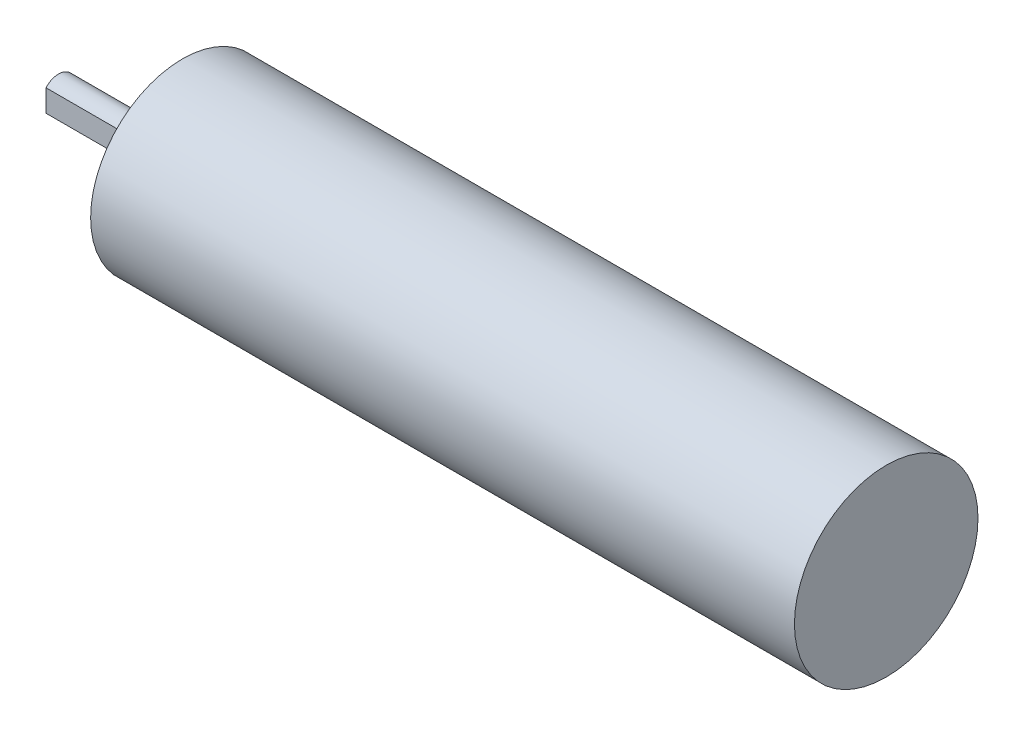
ISO-10303-21;
HEADER;
FILE_DESCRIPTION(('STEP AP214'),'2;1');
FILE_NAME('part.step','',(''),(''),'','','');
FILE_SCHEMA(('AUTOMOTIVE_DESIGN { 1 0 10303 214 1 1 1 1 }'));
ENDSEC;
DATA;
#1=APPLICATION_CONTEXT('core data for automotive mechanical design processes');
#2=APPLICATION_PROTOCOL_DEFINITION('international standard','automotive_design',2000,#1);
#3=PRODUCT_CONTEXT('',#1,'mechanical');
#4=PRODUCT('Part','Part','',(#3));
#5=PRODUCT_RELATED_PRODUCT_CATEGORY('part','',(#4));
#6=PRODUCT_DEFINITION_FORMATION('','',#4);
#7=PRODUCT_DEFINITION_CONTEXT('part definition',#1,'design');
#8=PRODUCT_DEFINITION('design','',#6,#7);
#9=PRODUCT_DEFINITION_SHAPE('','',#8);
#10=(LENGTH_UNIT() NAMED_UNIT(*) SI_UNIT(.MILLI.,.METRE.));
#11=(NAMED_UNIT(*) PLANE_ANGLE_UNIT() SI_UNIT($,.RADIAN.));
#12=(NAMED_UNIT(*) SI_UNIT($,.STERADIAN.) SOLID_ANGLE_UNIT());
#13=UNCERTAINTY_MEASURE_WITH_UNIT(LENGTH_MEASURE(1.E-05),#10,'distance_accuracy_value','');
#14=(GEOMETRIC_REPRESENTATION_CONTEXT(3) GLOBAL_UNCERTAINTY_ASSIGNED_CONTEXT((#13)) GLOBAL_UNIT_ASSIGNED_CONTEXT((#10,
#11,#12)) REPRESENTATION_CONTEXT('',''));
#15=CARTESIAN_POINT('',(0.,0.,0.));
#16=DIRECTION('',(0.,0.,1.));
#17=DIRECTION('',(1.,0.,0.));
#18=AXIS2_PLACEMENT_3D('',#15,#16,#17);
#19=CARTESIAN_POINT('',(-3.15,0.,0.));
#20=DIRECTION('',(-1.,0.,0.));
#21=DIRECTION('',(0.,0.,1.));
#22=AXIS2_PLACEMENT_3D('',#19,#20,#21);
#23=PLANE('',#22);
#24=CARTESIAN_POINT('',(-3.15,0.,0.));
#25=DIRECTION('',(-1.,0.,0.));
#26=DIRECTION('',(0.,0.,1.));
#27=AXIS2_PLACEMENT_3D('',#24,#25,#26);
#28=CIRCLE('',#27,3.5);
#29=CARTESIAN_POINT('',(-3.15,0.,3.5));
#30=VERTEX_POINT('',#29);
#31=EDGE_CURVE('E87',#30,#30,#28,.T.);
#32=ORIENTED_EDGE('',*,*,#31,.T.);
#33=EDGE_LOOP('',(#32));
#34=FACE_BOUND('',#33,.T.);
#35=CARTESIAN_POINT('',(-3.15,0.,0.));
#36=DIRECTION('',(-1.,0.,0.));
#37=DIRECTION('',(0.,0.,1.));
#38=AXIS2_PLACEMENT_3D('',#35,#36,#37);
#39=CIRCLE('',#38,2.);
#40=CARTESIAN_POINT('',(-3.15,0.,2.));
#41=VERTEX_POINT('',#40);
#42=EDGE_CURVE('E78',#41,#41,#39,.T.);
#43=ORIENTED_EDGE('',*,*,#42,.F.);
#44=EDGE_LOOP('',(#43));
#45=FACE_BOUND('',#44,.T.);
#46=ADVANCED_FACE('F36',(#34,#45),#23,.T.);
#47=CARTESIAN_POINT('',(-1.35,0.,0.));
#48=DIRECTION('',(-1.,0.,0.));
#49=DIRECTION('',(0.,0.,1.));
#50=AXIS2_PLACEMENT_3D('',#47,#48,#49);
#51=PLANE('',#50);
#52=CARTESIAN_POINT('',(-1.35,0.,0.));
#53=DIRECTION('',(-1.,0.,0.));
#54=DIRECTION('',(0.,0.,1.));
#55=AXIS2_PLACEMENT_3D('',#52,#53,#54);
#56=CIRCLE('',#55,5.);
#57=CARTESIAN_POINT('',(-1.35,0.,-5.));
#58=VERTEX_POINT('',#57);
#59=EDGE_CURVE('E45',#58,#58,#56,.T.);
#60=ORIENTED_EDGE('',*,*,#59,.T.);
#61=EDGE_LOOP('',(#60));
#62=FACE_BOUND('',#61,.T.);
#63=CARTESIAN_POINT('',(-1.35,0.,0.));
#64=DIRECTION('',(-1.,0.,0.));
#65=DIRECTION('',(0.,0.,1.));
#66=AXIS2_PLACEMENT_3D('',#63,#64,#65);
#67=CIRCLE('',#66,3.5);
#68=CARTESIAN_POINT('',(-1.35,0.,3.5));
#69=VERTEX_POINT('',#68);
#70=EDGE_CURVE('E84',#69,#69,#67,.T.);
#71=ORIENTED_EDGE('',*,*,#70,.F.);
#72=EDGE_LOOP('',(#71));
#73=FACE_BOUND('',#72,.T.);
#74=ADVANCED_FACE('F101',(#62,#73),#51,.T.);
#75=CARTESIAN_POINT('',(0.,11.,0.));
#76=DIRECTION('',(-1.,0.,0.));
#77=DIRECTION('',(0.,0.,1.));
#78=AXIS2_PLACEMENT_3D('',#75,#76,#77);
#79=PLANE('',#78);
#80=CARTESIAN_POINT('',(0.,6.06217782649,-3.5));
#81=DIRECTION('',(-1.,0.,0.));
#82=DIRECTION('',(0.,0.,1.));
#83=AXIS2_PLACEMENT_3D('',#80,#81,#82);
#84=CIRCLE('',#83,0.975000000000014);
#85=CARTESIAN_POINT('',(0.,6.06217782649,-2.52499999999999));
#86=VERTEX_POINT('',#85);
#87=EDGE_CURVE('E425',#86,#86,#84,.T.);
#88=ORIENTED_EDGE('',*,*,#87,.F.);
#89=EDGE_LOOP('',(#88));
#90=FACE_BOUND('',#89,.T.);
#91=CARTESIAN_POINT('',(0.,-6.06217782649,-3.5));
#92=DIRECTION('',(-1.,0.,0.));
#93=DIRECTION('',(0.,0.,1.));
#94=AXIS2_PLACEMENT_3D('',#91,#92,#93);
#95=CIRCLE('',#94,0.975000000000014);
#96=CARTESIAN_POINT('',(0.,-6.06217782649,-2.52499999999999));
#97=VERTEX_POINT('',#96);
#98=EDGE_CURVE('E431',#97,#97,#95,.T.);
#99=ORIENTED_EDGE('',*,*,#98,.F.);
#100=EDGE_LOOP('',(#99));
#101=FACE_BOUND('',#100,.T.);
#102=CARTESIAN_POINT('',(0.,0.,7.));
#103=DIRECTION('',(-1.,0.,0.));
#104=DIRECTION('',(0.,0.,1.));
#105=AXIS2_PLACEMENT_3D('',#102,#103,#104);
#106=CIRCLE('',#105,0.975000000000014);
#107=CARTESIAN_POINT('',(0.,0.,7.97500000000001));
#108=VERTEX_POINT('',#107);
#109=EDGE_CURVE('E437',#108,#108,#106,.T.);
#110=ORIENTED_EDGE('',*,*,#109,.F.);
#111=EDGE_LOOP('',(#110));
#112=FACE_BOUND('',#111,.T.);
#113=CARTESIAN_POINT('',(0.,0.,0.));
#114=DIRECTION('',(1.,0.,0.));
#115=DIRECTION('',(0.,0.,-1.));
#116=AXIS2_PLACEMENT_3D('',#113,#114,#115);
#117=CIRCLE('',#116,11.);
#118=CARTESIAN_POINT('',(0.,0.,-11.));
#119=VERTEX_POINT('',#118);
#120=EDGE_CURVE('E11',#119,#119,#117,.T.);
#121=ORIENTED_EDGE('',*,*,#120,.F.);
#122=EDGE_LOOP('',(#121));
#123=FACE_BOUND('',#122,.T.);
#124=CARTESIAN_POINT('',(0.,0.,0.));
#125=DIRECTION('',(-1.,0.,0.));
#126=DIRECTION('',(0.,0.,1.));
#127=AXIS2_PLACEMENT_3D('',#124,#125,#126);
#128=CIRCLE('',#127,5.);
#129=CARTESIAN_POINT('',(0.,0.,-5.));
#130=VERTEX_POINT('',#129);
#131=EDGE_CURVE('E90',#130,#130,#128,.T.);
#132=ORIENTED_EDGE('',*,*,#131,.F.);
#133=EDGE_LOOP('',(#132));
#134=FACE_BOUND('',#133,.T.);
#135=ADVANCED_FACE('F99',(#90,#101,#112,#123,#134),#79,.T.);
#136=CARTESIAN_POINT('',(0.,0.,0.));
#137=DIRECTION('',(1.,0.,0.));
#138=DIRECTION('',(0.,0.,-1.));
#139=AXIS2_PLACEMENT_3D('',#136,#137,#138);
#140=CYLINDRICAL_SURFACE('',#139,11.);
#141=ORIENTED_EDGE('',*,*,#120,.T.);
#142=EDGE_LOOP('',(#141));
#143=FACE_BOUND('',#142,.T.);
#144=CARTESIAN_POINT('',(84.35,0.,0.));
#145=DIRECTION('',(1.,0.,0.));
#146=DIRECTION('',(0.,0.,-1.));
#147=AXIS2_PLACEMENT_3D('',#144,#145,#146);
#148=CIRCLE('',#147,11.);
#149=CARTESIAN_POINT('',(84.35,0.,-11.));
#150=VERTEX_POINT('',#149);
#151=EDGE_CURVE('E400',#150,#150,#148,.T.);
#152=ORIENTED_EDGE('',*,*,#151,.F.);
#153=EDGE_LOOP('',(#152));
#154=FACE_BOUND('',#153,.T.);
#155=ADVANCED_FACE('F38',(#143,#154),#140,.T.);
#156=CARTESIAN_POINT('',(-1.35,0.,0.));
#157=DIRECTION('',(1.,0.,0.));
#158=DIRECTION('',(0.,0.,-1.));
#159=AXIS2_PLACEMENT_3D('',#156,#157,#158);
#160=CYLINDRICAL_SURFACE('',#159,5.);
#161=CARTESIAN_POINT('',(-1.35,0.,-5.));
#162=CARTESIAN_POINT('',(-1.3359375,0.,-5.));
#163=CARTESIAN_POINT('',(-1.321875,0.,-5.));
#164=CARTESIAN_POINT('',(-1.29375,0.,-5.));
#165=CARTESIAN_POINT('',(-1.2796875,0.,-5.));
#166=CARTESIAN_POINT('',(-1.2515625,0.,-5.));
#167=CARTESIAN_POINT('',(-1.2375,0.,-5.));
#168=CARTESIAN_POINT('',(-1.209375,0.,-5.));
#169=CARTESIAN_POINT('',(-1.1953125,0.,-5.));
#170=CARTESIAN_POINT('',(-1.1671875,0.,-5.));
#171=CARTESIAN_POINT('',(-1.153125,0.,-5.));
#172=CARTESIAN_POINT('',(-1.125,0.,-5.));
#173=CARTESIAN_POINT('',(-1.1109375,0.,-5.));
#174=CARTESIAN_POINT('',(-1.0828125,0.,-5.));
#175=CARTESIAN_POINT('',(-1.06875,0.,-5.));
#176=CARTESIAN_POINT('',(-1.040625,0.,-5.));
#177=CARTESIAN_POINT('',(-1.0265625,0.,-5.));
#178=CARTESIAN_POINT('',(-0.9984375,0.,-5.));
#179=CARTESIAN_POINT('',(-0.984375,0.,-5.));
#180=CARTESIAN_POINT('',(-0.95625,0.,-5.));
#181=CARTESIAN_POINT('',(-0.9421875,0.,-5.));
#182=CARTESIAN_POINT('',(-0.9140625,0.,-5.));
#183=CARTESIAN_POINT('',(-0.9,0.,-5.));
#184=CARTESIAN_POINT('',(-0.871875,0.,-5.));
#185=CARTESIAN_POINT('',(-0.8578125,0.,-5.));
#186=CARTESIAN_POINT('',(-0.8296875,0.,-5.));
#187=CARTESIAN_POINT('',(-0.815625,0.,-5.));
#188=CARTESIAN_POINT('',(-0.7875,0.,-5.));
#189=CARTESIAN_POINT('',(-0.7734375,0.,-5.));
#190=CARTESIAN_POINT('',(-0.7453125,0.,-5.));
#191=CARTESIAN_POINT('',(-0.73125,0.,-5.));
#192=CARTESIAN_POINT('',(-0.703125,0.,-5.));
#193=CARTESIAN_POINT('',(-0.6890625,0.,-5.));
#194=CARTESIAN_POINT('',(-0.6609375,0.,-5.));
#195=CARTESIAN_POINT('',(-0.646875,0.,-5.));
#196=CARTESIAN_POINT('',(-0.61875,0.,-5.));
#197=CARTESIAN_POINT('',(-0.6046875,0.,-5.));
#198=CARTESIAN_POINT('',(-0.5765625,0.,-5.));
#199=CARTESIAN_POINT('',(-0.5625,0.,-5.));
#200=CARTESIAN_POINT('',(-0.534375,0.,-5.));
#201=CARTESIAN_POINT('',(-0.5203125,0.,-5.));
#202=CARTESIAN_POINT('',(-0.4921875,0.,-5.));
#203=CARTESIAN_POINT('',(-0.478125,0.,-5.));
#204=CARTESIAN_POINT('',(-0.45,0.,-5.));
#205=CARTESIAN_POINT('',(-0.4359375,0.,-5.));
#206=CARTESIAN_POINT('',(-0.4078125,0.,-5.));
#207=CARTESIAN_POINT('',(-0.39375,0.,-5.));
#208=CARTESIAN_POINT('',(-0.365625,0.,-5.));
#209=CARTESIAN_POINT('',(-0.3515625,0.,-5.));
#210=CARTESIAN_POINT('',(-0.3234375,0.,-5.));
#211=CARTESIAN_POINT('',(-0.309375,0.,-5.));
#212=CARTESIAN_POINT('',(-0.28125,0.,-5.));
#213=CARTESIAN_POINT('',(-0.2671875,0.,-5.));
#214=CARTESIAN_POINT('',(-0.2390625,0.,-5.));
#215=CARTESIAN_POINT('',(-0.225,0.,-5.));
#216=CARTESIAN_POINT('',(-0.196875,0.,-5.));
#217=CARTESIAN_POINT('',(-0.1828125,0.,-5.));
#218=CARTESIAN_POINT('',(-0.1546875,0.,-5.));
#219=CARTESIAN_POINT('',(-0.140625,0.,-5.));
#220=CARTESIAN_POINT('',(-0.1125,0.,-5.));
#221=CARTESIAN_POINT('',(-0.0984374999999998,0.,-5.));
#222=CARTESIAN_POINT('',(-0.0703124999999998,0.,-5.));
#223=CARTESIAN_POINT('',(-0.0562499999999997,0.,-5.));
#224=CARTESIAN_POINT('',(-0.0281249999999997,0.,-5.));
#225=CARTESIAN_POINT('',(-0.0140624999999997,0.,-5.));
#226=CARTESIAN_POINT('',(0.,0.,-5.));
#227=B_SPLINE_CURVE_WITH_KNOTS('',3,(#161,#162,#163,#164,#165,#166,#167,#168,#169,#170,#171,
#172,#173,#174,#175,#176,#177,#178,#179,#180,#181,#182,#183,#184,#185,#186,#187,#188,#189,#190,
#191,#192,#193,#194,#195,#196,#197,#198,#199,#200,#201,#202,#203,#204,#205,#206,#207,#208,#209,
#210,#211,#212,#213,#214,#215,#216,#217,#218,#219,#220,#221,#222,#223,#224,#225,#226),
.UNSPECIFIED.,.F.,.F.,(4,2,2,2,2,2,2,2,2,2,2,2,2,2,2,2,2,2,2,2,2,2,2,2,2,2,2,2,2,2,2,2,4),(0.,
0.0421875000000001,0.084375,0.1265625,0.16875,0.2109375,0.253125,0.2953125,0.3375,0.3796875,
0.421875,0.4640625,0.50625,0.5484375,0.590625,0.6328125,0.675,0.7171875,0.759375,0.8015625,
0.84375,0.8859375,0.928125,0.9703125,1.0125,1.0546875,1.096875,1.1390625,1.18125,1.2234375,
1.265625,1.3078125,1.35),.UNSPECIFIED.);
#228=EDGE_CURVE('BSEAM97',#58,#130,#227,.T.);
#229=ORIENTED_EDGE('',*,*,#59,.F.);
#230=ORIENTED_EDGE('',*,*,#131,.T.);
#231=ORIENTED_EDGE('',*,*,#228,.T.);
#232=ORIENTED_EDGE('',*,*,#228,.F.);
#233=EDGE_LOOP('',(#229,#231,#230,#232));
#234=FACE_BOUND('',#233,.T.);
#235=ADVANCED_FACE('F97',(#234),#160,.T.);
#236=CARTESIAN_POINT('',(-3.15,0.,0.));
#237=DIRECTION('',(1.,0.,0.));
#238=DIRECTION('',(0.,0.,-1.));
#239=AXIS2_PLACEMENT_3D('',#236,#237,#238);
#240=CYLINDRICAL_SURFACE('',#239,3.5);
#241=ORIENTED_EDGE('',*,*,#31,.F.);
#242=EDGE_LOOP('',(#241));
#243=FACE_BOUND('',#242,.T.);
#244=ORIENTED_EDGE('',*,*,#70,.T.);
#245=EDGE_LOOP('',(#244));
#246=FACE_BOUND('',#245,.T.);
#247=ADVANCED_FACE('F122',(#243,#246),#240,.T.);
#248=CARTESIAN_POINT('',(-14.85,0.,0.));
#249=DIRECTION('',(1.,0.,0.));
#250=DIRECTION('',(0.,0.,-1.));
#251=AXIS2_PLACEMENT_3D('',#248,#249,#250);
#252=CYLINDRICAL_SURFACE('',#251,2.);
#253=CARTESIAN_POINT('',(-14.85,0.,0.));
#254=DIRECTION('',(-1.,0.,0.));
#255=DIRECTION('',(0.,0.,1.));
#256=AXIS2_PLACEMENT_3D('',#253,#254,#255);
#257=CIRCLE('',#256,2.);
#258=CARTESIAN_POINT('',(-14.85,1.32287565553165,1.50000000000057));
#259=VERTEX_POINT('',#258);
#260=CARTESIAN_POINT('',(-14.85,-1.32287565553165,1.50000000000057));
#261=VERTEX_POINT('',#260);
#262=EDGE_CURVE('E82',#259,#261,#257,.T.);
#263=ORIENTED_EDGE('',*,*,#262,.F.);
#264=DIRECTION('',(-1.,0.,0.));
#265=VECTOR('',#264,1.);
#266=CARTESIAN_POINT('',(-2.34976552175177,1.32287565553165,1.50000000000057));
#267=LINE('',#266,#265);
#268=CARTESIAN_POINT('',(-5.84999999999943,1.32287565553165,1.50000000000057));
#269=VERTEX_POINT('',#268);
#270=EDGE_CURVE('E52',#269,#259,#267,.T.);
#271=ORIENTED_EDGE('',*,*,#270,.F.);
#272=CARTESIAN_POINT('',(-7.35,0.,0.));
#273=DIRECTION('',(0.707106781186547,0.,-0.707106781186548));
#274=DIRECTION('',(-0.707106781186548,0.,-0.707106781186547));
#275=AXIS2_PLACEMENT_3D('',#272,#273,#274);
#276=ELLIPSE('',#275,2.82842712474619,2.);
#277=CARTESIAN_POINT('',(-5.84999999999943,-1.32287565553165,1.50000000000057));
#278=VERTEX_POINT('',#277);
#279=EDGE_CURVE('E70',#278,#269,#276,.F.);
#280=ORIENTED_EDGE('',*,*,#279,.F.);
#281=DIRECTION('',(-1.,0.,0.));
#282=VECTOR('',#281,1.);
#283=CARTESIAN_POINT('',(-2.34976552175177,-1.32287565553165,1.50000000000057));
#284=LINE('',#283,#282);
#285=EDGE_CURVE('E61',#278,#261,#284,.T.);
#286=ORIENTED_EDGE('',*,*,#285,.T.);
#287=EDGE_LOOP('',(#263,#271,#280,#286));
#288=FACE_BOUND('',#287,.T.);
#289=ORIENTED_EDGE('',*,*,#42,.T.);
#290=EDGE_LOOP('',(#289));
#291=FACE_BOUND('',#290,.T.);
#292=ADVANCED_FACE('F75',(#288,#291),#252,.T.);
#293=CARTESIAN_POINT('',(-14.85,0.,0.));
#294=DIRECTION('',(-1.,0.,0.));
#295=DIRECTION('',(0.,0.,1.));
#296=AXIS2_PLACEMENT_3D('',#293,#294,#295);
#297=PLANE('',#296);
#298=DIRECTION('',(0.,-1.,0.));
#299=VECTOR('',#298,1.);
#300=CARTESIAN_POINT('',(-14.85,1.32287565553165,1.50000000000057));
#301=LINE('',#300,#299);
#302=EDGE_CURVE('E57',#259,#261,#301,.T.);
#303=ORIENTED_EDGE('',*,*,#302,.F.);
#304=ORIENTED_EDGE('',*,*,#262,.T.);
#305=EDGE_LOOP('',(#303,#304));
#306=FACE_BOUND('',#305,.T.);
#307=ADVANCED_FACE('F146',(#306),#297,.T.);
#308=CARTESIAN_POINT('',(-3.675,0.,3.675));
#309=DIRECTION('',(0.707106781186547,0.,-0.707106781186548));
#310=DIRECTION('',(-0.707106781186548,0.,-0.707106781186547));
#311=AXIS2_PLACEMENT_3D('',#308,#309,#310);
#312=PLANE('',#311);
#313=ORIENTED_EDGE('',*,*,#279,.T.);
#314=DIRECTION('',(0.,-1.,0.));
#315=VECTOR('',#314,1.);
#316=CARTESIAN_POINT('',(-5.84999999999943,1.32287565553165,1.50000000000057));
#317=LINE('',#316,#315);
#318=EDGE_CURVE('E64',#269,#278,#317,.T.);
#319=ORIENTED_EDGE('',*,*,#318,.T.);
#320=EDGE_LOOP('',(#313,#319));
#321=FACE_BOUND('',#320,.T.);
#322=ADVANCED_FACE('F73',(#321),#312,.F.);
#323=CARTESIAN_POINT('',(-2.34976552175177,1.32287565553165,1.50000000000057));
#324=DIRECTION('',(0.,0.,-1.));
#325=DIRECTION('',(0.,1.,0.));
#326=AXIS2_PLACEMENT_3D('',#323,#324,#325);
#327=PLANE('',#326);
#328=ORIENTED_EDGE('',*,*,#270,.T.);
#329=ORIENTED_EDGE('',*,*,#302,.T.);
#330=ORIENTED_EDGE('',*,*,#285,.F.);
#331=ORIENTED_EDGE('',*,*,#318,.F.);
#332=EDGE_LOOP('',(#328,#329,#330,#331));
#333=FACE_BOUND('',#332,.T.);
#334=ADVANCED_FACE('F63',(#333),#327,.F.);
#335=CARTESIAN_POINT('',(6.50000000000001,0.,7.));
#336=DIRECTION('',(1.,0.,0.));
#337=DIRECTION('',(0.,0.,-1.));
#338=AXIS2_PLACEMENT_3D('',#335,#336,#337);
#339=PLANE('',#338);
#340=CARTESIAN_POINT('',(6.50000000000001,0.,7.));
#341=DIRECTION('',(-1.,0.,0.));
#342=DIRECTION('',(0.,0.,1.));
#343=AXIS2_PLACEMENT_3D('',#340,#341,#342);
#344=CIRCLE('',#343,0.975000000000014);
#345=CARTESIAN_POINT('',(6.50000000000001,0.,7.97500000000001));
#346=VERTEX_POINT('',#345);
#347=EDGE_CURVE('E440',#346,#346,#344,.T.);
#348=ORIENTED_EDGE('',*,*,#347,.T.);
#349=EDGE_LOOP('',(#348));
#350=FACE_BOUND('',#349,.T.);
#351=ADVANCED_FACE('F164',(#350),#339,.F.);
#352=CARTESIAN_POINT('',(0.,0.,7.));
#353=DIRECTION('',(-1.,0.,0.));
#354=DIRECTION('',(0.,0.,1.));
#355=AXIS2_PLACEMENT_3D('',#352,#353,#354);
#356=CYLINDRICAL_SURFACE('',#355,0.975000000000014);
#357=ORIENTED_EDGE('',*,*,#347,.F.);
#358=EDGE_LOOP('',(#357));
#359=FACE_BOUND('',#358,.T.);
#360=ORIENTED_EDGE('',*,*,#109,.T.);
#361=EDGE_LOOP('',(#360));
#362=FACE_BOUND('',#361,.T.);
#363=ADVANCED_FACE('F171',(#359,#362),#356,.F.);
#364=CARTESIAN_POINT('',(6.50000000000001,-6.06217782649,-3.5));
#365=DIRECTION('',(1.,0.,0.));
#366=DIRECTION('',(0.,0.,-1.));
#367=AXIS2_PLACEMENT_3D('',#364,#365,#366);
#368=PLANE('',#367);
#369=CARTESIAN_POINT('',(6.50000000000001,-6.06217782649,-3.5));
#370=DIRECTION('',(-1.,0.,0.));
#371=DIRECTION('',(0.,0.,1.));
#372=AXIS2_PLACEMENT_3D('',#369,#370,#371);
#373=CIRCLE('',#372,0.975000000000014);
#374=CARTESIAN_POINT('',(6.50000000000001,-6.06217782649,-2.52499999999999));
#375=VERTEX_POINT('',#374);
#376=EDGE_CURVE('E434',#375,#375,#373,.T.);
#377=ORIENTED_EDGE('',*,*,#376,.T.);
#378=EDGE_LOOP('',(#377));
#379=FACE_BOUND('',#378,.T.);
#380=ADVANCED_FACE('F179',(#379),#368,.F.);
#381=CARTESIAN_POINT('',(0.,-6.06217782649,-3.5));
#382=DIRECTION('',(-1.,0.,0.));
#383=DIRECTION('',(0.,0.,1.));
#384=AXIS2_PLACEMENT_3D('',#381,#382,#383);
#385=CYLINDRICAL_SURFACE('',#384,0.975000000000014);
#386=ORIENTED_EDGE('',*,*,#376,.F.);
#387=EDGE_LOOP('',(#386));
#388=FACE_BOUND('',#387,.T.);
#389=ORIENTED_EDGE('',*,*,#98,.T.);
#390=EDGE_LOOP('',(#389));
#391=FACE_BOUND('',#390,.T.);
#392=ADVANCED_FACE('F187',(#388,#391),#385,.F.);
#393=CARTESIAN_POINT('',(6.50000000000001,6.06217782649,-3.5));
#394=DIRECTION('',(1.,0.,0.));
#395=DIRECTION('',(0.,0.,-1.));
#396=AXIS2_PLACEMENT_3D('',#393,#394,#395);
#397=PLANE('',#396);
#398=CARTESIAN_POINT('',(6.50000000000001,6.06217782649,-3.5));
#399=DIRECTION('',(-1.,0.,0.));
#400=DIRECTION('',(0.,0.,1.));
#401=AXIS2_PLACEMENT_3D('',#398,#399,#400);
#402=CIRCLE('',#401,0.975000000000014);
#403=CARTESIAN_POINT('',(6.50000000000001,6.06217782649,-2.52499999999999));
#404=VERTEX_POINT('',#403);
#405=EDGE_CURVE('E428',#404,#404,#402,.T.);
#406=ORIENTED_EDGE('',*,*,#405,.T.);
#407=EDGE_LOOP('',(#406));
#408=FACE_BOUND('',#407,.T.);
#409=ADVANCED_FACE('F195',(#408),#397,.F.);
#410=CARTESIAN_POINT('',(0.,6.06217782649,-3.5));
#411=DIRECTION('',(-1.,0.,0.));
#412=DIRECTION('',(0.,0.,1.));
#413=AXIS2_PLACEMENT_3D('',#410,#411,#412);
#414=CYLINDRICAL_SURFACE('',#413,0.975000000000014);
#415=ORIENTED_EDGE('',*,*,#405,.F.);
#416=EDGE_LOOP('',(#415));
#417=FACE_BOUND('',#416,.T.);
#418=ORIENTED_EDGE('',*,*,#87,.T.);
#419=EDGE_LOOP('',(#418));
#420=FACE_BOUND('',#419,.T.);
#421=ADVANCED_FACE('F203',(#417,#420),#414,.F.);
#422=CARTESIAN_POINT('',(84.35,0.,0.));
#423=DIRECTION('',(1.,0.,0.));
#424=DIRECTION('',(0.,0.,-1.));
#425=AXIS2_PLACEMENT_3D('',#422,#423,#424);
#426=PLANE('',#425);
#427=ORIENTED_EDGE('',*,*,#151,.T.);
#428=EDGE_LOOP('',(#427));
#429=FACE_BOUND('',#428,.T.);
#430=ADVANCED_FACE('F211',(#429),#426,.T.);
#431=CLOSED_SHELL('',(#46,#74,#135,#155,#235,#247,#292,#307,#322,#334,#351,#363,#380,#392,#409,
#421,#430));
#432=CARTESIAN_POINT('',(46.2,0.,0.));
#433=DIRECTION('',(-1.,0.,0.));
#434=DIRECTION('',(0.,0.,1.));
#435=AXIS2_PLACEMENT_3D('',#432,#433,#434);
#436=PLANE('',#435);
#437=CARTESIAN_POINT('',(46.2,0.,0.));
#438=DIRECTION('',(1.,0.,0.));
#439=DIRECTION('',(0.,0.,-1.));
#440=AXIS2_PLACEMENT_3D('',#437,#438,#439);
#441=CIRCLE('',#440,3.50000000000001);
#442=CARTESIAN_POINT('',(46.2,0.,-3.50000000000001));
#443=VERTEX_POINT('',#442);
#444=EDGE_CURVE('E422',#443,#443,#441,.T.);
#445=ORIENTED_EDGE('',*,*,#444,.T.);
#446=EDGE_LOOP('',(#445));
#447=FACE_BOUND('',#446,.T.);
#448=ADVANCED_FACE('F225',(#447),#436,.F.);
#449=CARTESIAN_POINT('',(52.6,0.,0.));
#450=DIRECTION('',(1.,0.,0.));
#451=DIRECTION('',(0.,0.,-1.));
#452=AXIS2_PLACEMENT_3D('',#449,#450,#451);
#453=CYLINDRICAL_SURFACE('',#452,3.50000000000001);
#454=ORIENTED_EDGE('',*,*,#444,.F.);
#455=EDGE_LOOP('',(#454));
#456=FACE_BOUND('',#455,.T.);
#457=CARTESIAN_POINT('',(52.6,0.,0.));
#458=DIRECTION('',(1.,0.,0.));
#459=DIRECTION('',(0.,0.,-1.));
#460=AXIS2_PLACEMENT_3D('',#457,#458,#459);
#461=CIRCLE('',#460,3.50000000000001);
#462=CARTESIAN_POINT('',(52.6,0.,-3.50000000000001));
#463=VERTEX_POINT('',#462);
#464=EDGE_CURVE('E410',#463,#463,#461,.F.);
#465=ORIENTED_EDGE('',*,*,#464,.F.);
#466=EDGE_LOOP('',(#465));
#467=FACE_BOUND('',#466,.T.);
#468=ADVANCED_FACE('F228',(#456,#467),#453,.F.);
#469=CARTESIAN_POINT('',(52.6,0.,0.));
#470=DIRECTION('',(1.,0.,0.));
#471=DIRECTION('',(0.,0.,-1.));
#472=AXIS2_PLACEMENT_3D('',#469,#470,#471);
#473=PLANE('',#472);
#474=ORIENTED_EDGE('',*,*,#464,.T.);
#475=EDGE_LOOP('',(#474));
#476=FACE_BOUND('',#475,.T.);
#477=ADVANCED_FACE('F237',(#476),#473,.F.);
#478=CLOSED_SHELL('',(#448,#468,#477));
#479=CARTESIAN_POINT('',(49.6,0.,8.5));
#480=DIRECTION('',(-1.,0.,0.));
#481=DIRECTION('',(0.,0.,1.));
#482=AXIS2_PLACEMENT_3D('',#479,#480,#481);
#483=PLANE('',#482);
#484=CARTESIAN_POINT('',(49.6,0.,8.5));
#485=DIRECTION('',(1.,0.,0.));
#486=DIRECTION('',(0.,0.,-1.));
#487=AXIS2_PLACEMENT_3D('',#484,#485,#486);
#488=CIRCLE('',#487,1.05000000000001);
#489=CARTESIAN_POINT('',(49.6,0.,7.44999999999999));
#490=VERTEX_POINT('',#489);
#491=EDGE_CURVE('E419',#490,#490,#488,.T.);
#492=ORIENTED_EDGE('',*,*,#491,.T.);
#493=EDGE_LOOP('',(#492));
#494=FACE_BOUND('',#493,.T.);
#495=ADVANCED_FACE('F252',(#494),#483,.F.);
#496=CARTESIAN_POINT('',(52.6,0.,8.5));
#497=DIRECTION('',(1.,0.,0.));
#498=DIRECTION('',(0.,0.,-1.));
#499=AXIS2_PLACEMENT_3D('',#496,#497,#498);
#500=CYLINDRICAL_SURFACE('',#499,1.05000000000001);
#501=ORIENTED_EDGE('',*,*,#491,.F.);
#502=EDGE_LOOP('',(#501));
#503=FACE_BOUND('',#502,.T.);
#504=CARTESIAN_POINT('',(52.6,0.,8.5));
#505=DIRECTION('',(1.,0.,0.));
#506=DIRECTION('',(0.,0.,-1.));
#507=AXIS2_PLACEMENT_3D('',#504,#505,#506);
#508=CIRCLE('',#507,1.05000000000001);
#509=CARTESIAN_POINT('',(52.6,0.,7.44999999999999));
#510=VERTEX_POINT('',#509);
#511=EDGE_CURVE('E403',#510,#510,#508,.F.);
#512=ORIENTED_EDGE('',*,*,#511,.F.);
#513=EDGE_LOOP('',(#512));
#514=FACE_BOUND('',#513,.T.);
#515=ADVANCED_FACE('F255',(#503,#514),#500,.F.);
#516=ORIENTED_EDGE('',*,*,#511,.T.);
#517=EDGE_LOOP('',(#516));
#518=FACE_BOUND('',#517,.T.);
#519=ADVANCED_FACE('F247',(#518),#473,.F.);
#520=CLOSED_SHELL('',(#495,#515,#519));
#521=CARTESIAN_POINT('',(49.6,-7.36121593217,-4.25));
#522=DIRECTION('',(-1.,0.,0.));
#523=DIRECTION('',(0.,0.,1.));
#524=AXIS2_PLACEMENT_3D('',#521,#522,#523);
#525=PLANE('',#524);
#526=CARTESIAN_POINT('',(49.6,-7.36121593217,-4.25));
#527=DIRECTION('',(1.,0.,0.));
#528=DIRECTION('',(0.,0.,-1.));
#529=AXIS2_PLACEMENT_3D('',#526,#527,#528);
#530=CIRCLE('',#529,1.05000000000001);
#531=CARTESIAN_POINT('',(49.6,-7.36121593217,-5.30000000000001));
#532=VERTEX_POINT('',#531);
#533=EDGE_CURVE('E416',#532,#532,#530,.T.);
#534=ORIENTED_EDGE('',*,*,#533,.T.);
#535=EDGE_LOOP('',(#534));
#536=FACE_BOUND('',#535,.T.);
#537=ADVANCED_FACE('F277',(#536),#525,.F.);
#538=CARTESIAN_POINT('',(52.6,-7.36121593217,-4.25));
#539=DIRECTION('',(1.,0.,0.));
#540=DIRECTION('',(0.,0.,-1.));
#541=AXIS2_PLACEMENT_3D('',#538,#539,#540);
#542=CYLINDRICAL_SURFACE('',#541,1.05000000000001);
#543=ORIENTED_EDGE('',*,*,#533,.F.);
#544=EDGE_LOOP('',(#543));
#545=FACE_BOUND('',#544,.T.);
#546=CARTESIAN_POINT('',(52.6,-7.36121593217,-4.25));
#547=DIRECTION('',(1.,0.,0.));
#548=DIRECTION('',(0.,0.,-1.));
#549=AXIS2_PLACEMENT_3D('',#546,#547,#548);
#550=CIRCLE('',#549,1.05000000000001);
#551=CARTESIAN_POINT('',(52.6,-7.36121593217,-5.30000000000001));
#552=VERTEX_POINT('',#551);
#553=EDGE_CURVE('E399',#552,#552,#550,.F.);
#554=ORIENTED_EDGE('',*,*,#553,.F.);
#555=EDGE_LOOP('',(#554));
#556=FACE_BOUND('',#555,.T.);
#557=ADVANCED_FACE('F280',(#545,#556),#542,.F.);
#558=ORIENTED_EDGE('',*,*,#553,.T.);
#559=EDGE_LOOP('',(#558));
#560=FACE_BOUND('',#559,.T.);
#561=ADVANCED_FACE('F273',(#560),#473,.F.);
#562=CLOSED_SHELL('',(#537,#557,#561));
#563=CARTESIAN_POINT('',(49.6,7.36121593217,-4.25));
#564=DIRECTION('',(-1.,0.,0.));
#565=DIRECTION('',(0.,0.,1.));
#566=AXIS2_PLACEMENT_3D('',#563,#564,#565);
#567=PLANE('',#566);
#568=CARTESIAN_POINT('',(49.6,7.36121593217,-4.25));
#569=DIRECTION('',(1.,0.,0.));
#570=DIRECTION('',(0.,0.,-1.));
#571=AXIS2_PLACEMENT_3D('',#568,#569,#570);
#572=CIRCLE('',#571,1.05000000000001);
#573=CARTESIAN_POINT('',(49.6,7.36121593217,-5.30000000000001));
#574=VERTEX_POINT('',#573);
#575=EDGE_CURVE('E413',#574,#574,#572,.T.);
#576=ORIENTED_EDGE('',*,*,#575,.T.);
#577=EDGE_LOOP('',(#576));
#578=FACE_BOUND('',#577,.T.);
#579=ADVANCED_FACE('F301',(#578),#567,.F.);
#580=CARTESIAN_POINT('',(52.6,7.36121593217,-4.25));
#581=DIRECTION('',(1.,0.,0.));
#582=DIRECTION('',(0.,0.,-1.));
#583=AXIS2_PLACEMENT_3D('',#580,#581,#582);
#584=CYLINDRICAL_SURFACE('',#583,1.05000000000001);
#585=ORIENTED_EDGE('',*,*,#575,.F.);
#586=EDGE_LOOP('',(#585));
#587=FACE_BOUND('',#586,.T.);
#588=CARTESIAN_POINT('',(52.6,7.36121593217,-4.25));
#589=DIRECTION('',(1.,0.,0.));
#590=DIRECTION('',(0.,0.,-1.));
#591=AXIS2_PLACEMENT_3D('',#588,#589,#590);
#592=CIRCLE('',#591,1.05000000000001);
#593=CARTESIAN_POINT('',(52.6,7.36121593217,-5.30000000000001));
#594=VERTEX_POINT('',#593);
#595=EDGE_CURVE('E397',#594,#594,#592,.F.);
#596=ORIENTED_EDGE('',*,*,#595,.F.);
#597=EDGE_LOOP('',(#596));
#598=FACE_BOUND('',#597,.T.);
#599=ADVANCED_FACE('F304',(#587,#598),#584,.F.);
#600=ORIENTED_EDGE('',*,*,#595,.T.);
#601=EDGE_LOOP('',(#600));
#602=FACE_BOUND('',#601,.T.);
#603=ADVANCED_FACE('F248',(#602),#473,.F.);
#604=CLOSED_SHELL('',(#579,#599,#603));
#605=ORIENTED_CLOSED_SHELL('',*,#478,.T.);
#606=ORIENTED_CLOSED_SHELL('',*,#520,.T.);
#607=ORIENTED_CLOSED_SHELL('',*,#562,.T.);
#608=ORIENTED_CLOSED_SHELL('',*,#604,.T.);
#609=BREP_WITH_VOIDS('B2',#431,(#605,#606,#607,#608));
#610=ADVANCED_BREP_SHAPE_REPRESENTATION('',(#18,#609),#14);
#611=SHAPE_DEFINITION_REPRESENTATION(#9,#610);
ENDSEC;
END-ISO-10303-21;
